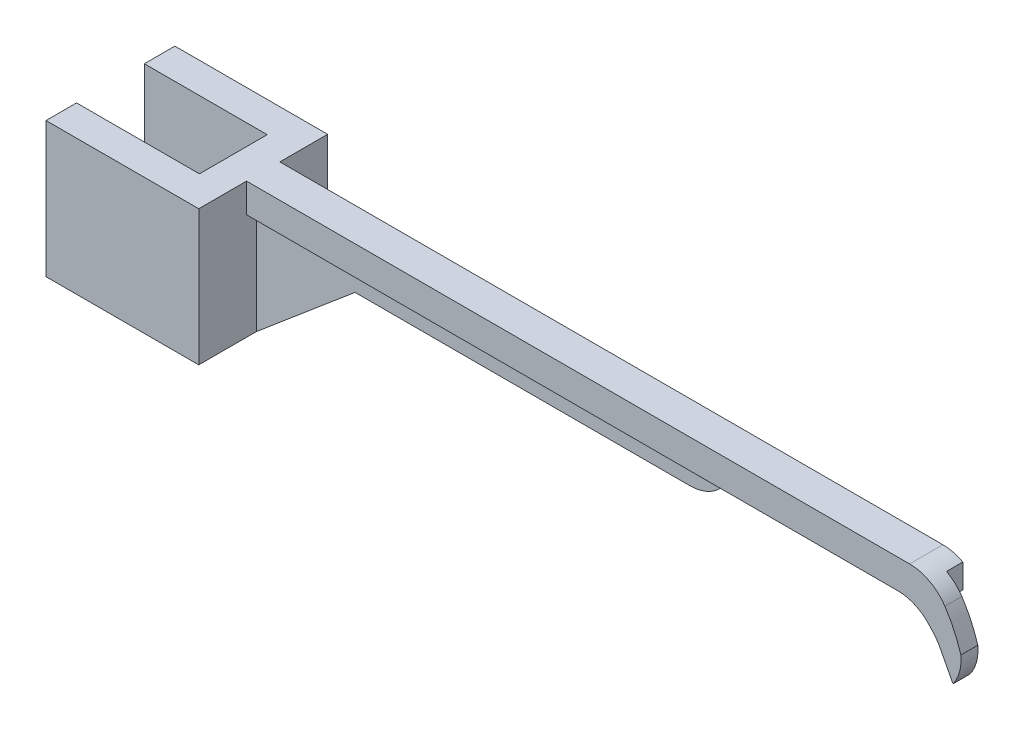
ISO-10303-21;
HEADER;
FILE_DESCRIPTION(('STEP AP214'),'2;1');
FILE_NAME('part.step','',(''),(''),'','','');
FILE_SCHEMA(('AUTOMOTIVE_DESIGN { 1 0 10303 214 1 1 1 1 }'));
ENDSEC;
DATA;
#1=APPLICATION_CONTEXT('core data for automotive mechanical design processes');
#2=APPLICATION_PROTOCOL_DEFINITION('international standard','automotive_design',2000,#1);
#3=PRODUCT_CONTEXT('',#1,'mechanical');
#4=PRODUCT('Part','Part','',(#3));
#5=PRODUCT_RELATED_PRODUCT_CATEGORY('part','',(#4));
#6=PRODUCT_DEFINITION_FORMATION('','',#4);
#7=PRODUCT_DEFINITION_CONTEXT('part definition',#1,'design');
#8=PRODUCT_DEFINITION('design','',#6,#7);
#9=PRODUCT_DEFINITION_SHAPE('','',#8);
#10=(LENGTH_UNIT() NAMED_UNIT(*) SI_UNIT(.MILLI.,.METRE.));
#11=(NAMED_UNIT(*) PLANE_ANGLE_UNIT() SI_UNIT($,.RADIAN.));
#12=(NAMED_UNIT(*) SI_UNIT($,.STERADIAN.) SOLID_ANGLE_UNIT());
#13=UNCERTAINTY_MEASURE_WITH_UNIT(LENGTH_MEASURE(1.E-05),#10,'distance_accuracy_value','');
#14=(GEOMETRIC_REPRESENTATION_CONTEXT(3) GLOBAL_UNCERTAINTY_ASSIGNED_CONTEXT((#13)) GLOBAL_UNIT_ASSIGNED_CONTEXT((#10,
#11,#12)) REPRESENTATION_CONTEXT('',''));
#15=CARTESIAN_POINT('',(0.,0.,0.));
#16=DIRECTION('',(0.,0.,1.));
#17=DIRECTION('',(1.,0.,0.));
#18=AXIS2_PLACEMENT_3D('',#15,#16,#17);
#19=CARTESIAN_POINT('',(2.38655555036114,14.2480483366258,0.));
#20=DIRECTION('',(0.,1.,0.));
#21=DIRECTION('',(0.,0.,1.));
#22=AXIS2_PLACEMENT_3D('',#19,#20,#21);
#23=PLANE('',#22);
#24=DIRECTION('',(0.,0.,1.));
#25=VECTOR('',#24,1.);
#26=CARTESIAN_POINT('',(-19.8893279320322,14.2480483366258,0.));
#27=LINE('',#26,#25);
#28=CARTESIAN_POINT('',(-19.8893279320322,14.2480483366258,-3.99999908856179));
#29=VERTEX_POINT('',#28);
#30=CARTESIAN_POINT('',(-19.8893279320322,14.2480483366258,4.000000606218));
#31=VERTEX_POINT('',#30);
#32=EDGE_CURVE('E321',#29,#31,#27,.T.);
#33=ORIENTED_EDGE('',*,*,#32,.T.);
#34=DIRECTION('',(-1.,0.,0.));
#35=VECTOR('',#34,1.);
#36=CARTESIAN_POINT('',(2.38655555036114,14.2480483366258,4.000000606218));
#37=LINE('',#36,#35);
#38=CARTESIAN_POINT('',(-34.385362257858,14.2480483366258,4.000000606218));
#39=VERTEX_POINT('',#38);
#40=EDGE_CURVE('E317',#31,#39,#37,.T.);
#41=ORIENTED_EDGE('',*,*,#40,.T.);
#42=DIRECTION('',(0.,0.,-1.));
#43=VECTOR('',#42,1.);
#44=CARTESIAN_POINT('',(-34.385362257858,14.2480483366258,-4.6027397260274));
#45=LINE('',#44,#43);
#46=CARTESIAN_POINT('',(-34.385362257858,14.2480483366258,7.6027397260274));
#47=VERTEX_POINT('',#46);
#48=EDGE_CURVE('E66',#47,#39,#45,.T.);
#49=ORIENTED_EDGE('',*,*,#48,.F.);
#50=DIRECTION('',(-1.,0.,0.));
#51=VECTOR('',#50,1.);
#52=CARTESIAN_POINT('',(-34.385362257858,14.2480483366258,7.6027397260274));
#53=LINE('',#52,#51);
#54=CARTESIAN_POINT('',(-16.3650904026096,14.2480483366258,7.6027397260274));
#55=VERTEX_POINT('',#54);
#56=EDGE_CURVE('E258',#55,#47,#53,.T.);
#57=ORIENTED_EDGE('',*,*,#56,.F.);
#58=DIRECTION('',(0.,0.,1.));
#59=VECTOR('',#58,1.);
#60=CARTESIAN_POINT('',(-16.3650904026096,14.2480483366258,0.));
#61=LINE('',#60,#59);
#62=CARTESIAN_POINT('',(-16.3650904026096,14.2480483366258,1.96383561643835));
#63=VERTEX_POINT('',#62);
#64=EDGE_CURVE('E368',#63,#55,#61,.T.);
#65=ORIENTED_EDGE('',*,*,#64,.F.);
#66=DIRECTION('',(-1.,0.,0.));
#67=VECTOR('',#66,1.);
#68=CARTESIAN_POINT('',(2.38655555036114,14.2480483366258,1.96383561643835));
#69=LINE('',#68,#67);
#70=CARTESIAN_POINT('',(61.853376654431,14.2480483366258,1.96383561643836));
#71=VERTEX_POINT('',#70);
#72=EDGE_CURVE('E370',#71,#63,#69,.T.);
#73=ORIENTED_EDGE('',*,*,#72,.F.);
#74=DIRECTION('',(0.,0.,-1.));
#75=VECTOR('',#74,1.);
#76=CARTESIAN_POINT('',(61.853376654431,14.2480483366258,0.));
#77=LINE('',#76,#75);
#78=CARTESIAN_POINT('',(61.853376654431,14.2480483366258,-1.96383561643835));
#79=VERTEX_POINT('',#78);
#80=EDGE_CURVE('E387',#71,#79,#77,.T.);
#81=ORIENTED_EDGE('',*,*,#80,.T.);
#82=DIRECTION('',(1.,0.,0.));
#83=VECTOR('',#82,1.);
#84=CARTESIAN_POINT('',(2.38655555036114,14.2480483366258,-1.96383561643836));
#85=LINE('',#84,#83);
#86=CARTESIAN_POINT('',(-16.3650904026096,14.2480483366258,-1.96383561643836));
#87=VERTEX_POINT('',#86);
#88=EDGE_CURVE('E361',#87,#79,#85,.T.);
#89=ORIENTED_EDGE('',*,*,#88,.F.);
#90=DIRECTION('',(0.,0.,1.));
#91=VECTOR('',#90,1.);
#92=CARTESIAN_POINT('',(-16.3650904026096,14.2480483366258,0.));
#93=LINE('',#92,#91);
#94=CARTESIAN_POINT('',(-16.3650904026096,14.2480483366258,-7.6027397260274));
#95=VERTEX_POINT('',#94);
#96=EDGE_CURVE('E366',#95,#87,#93,.T.);
#97=ORIENTED_EDGE('',*,*,#96,.F.);
#98=DIRECTION('',(1.,0.,0.));
#99=VECTOR('',#98,1.);
#100=CARTESIAN_POINT('',(-16.3650904026096,14.2480483366258,-7.6027397260274));
#101=LINE('',#100,#99);
#102=CARTESIAN_POINT('',(-34.385362257858,14.2480483366258,-7.6027397260274));
#103=VERTEX_POINT('',#102);
#104=EDGE_CURVE('E244',#103,#95,#101,.T.);
#105=ORIENTED_EDGE('',*,*,#104,.F.);
#106=CARTESIAN_POINT('',(-34.385362257858,14.2480483366258,-3.99999908856179));
#107=VERTEX_POINT('',#106);
#108=EDGE_CURVE('E279',#107,#103,#45,.T.);
#109=ORIENTED_EDGE('',*,*,#108,.F.);
#110=DIRECTION('',(1.,0.,0.));
#111=VECTOR('',#110,1.);
#112=CARTESIAN_POINT('',(2.38655555036114,14.2480483366258,-3.99999908856179));
#113=LINE('',#112,#111);
#114=EDGE_CURVE('E378',#107,#29,#113,.T.);
#115=ORIENTED_EDGE('',*,*,#114,.T.);
#116=EDGE_LOOP('',(#33,#41,#49,#57,#65,#73,#81,#89,#97,#105,#109,#115));
#117=FACE_BOUND('',#116,.T.);
#118=ADVANCED_FACE('F44',(#117),#23,.T.);
#119=CARTESIAN_POINT('',(-16.3650904026096,16.7028428571737,1.96383561643835));
#120=DIRECTION('',(-1.,0.,0.));
#121=DIRECTION('',(0.,0.,1.));
#122=AXIS2_PLACEMENT_3D('',#119,#120,#121);
#123=PLANE('',#122);
#124=DIRECTION('',(0.,-1.,0.));
#125=VECTOR('',#124,1.);
#126=CARTESIAN_POINT('',(-16.3650904026096,10.8113360078586,-0.797808219178089));
#127=LINE('',#126,#125);
#128=CARTESIAN_POINT('',(-16.3650904026096,10.8113360078586,-0.797808219178089));
#129=VERTEX_POINT('',#128);
#130=CARTESIAN_POINT('',(-16.3650904026096,-1.70811604693589,-0.797808219178082));
#131=VERTEX_POINT('',#130);
#132=EDGE_CURVE('E224',#129,#131,#127,.T.);
#133=ORIENTED_EDGE('',*,*,#132,.T.);
#134=DIRECTION('',(0.,0.,-1.));
#135=VECTOR('',#134,1.);
#136=CARTESIAN_POINT('',(-16.3650904026096,-1.70811604693589,1.96383561643835));
#137=LINE('',#136,#135);
#138=CARTESIAN_POINT('',(-16.3650904026096,-1.70811604693589,-7.6027397260274));
#139=VERTEX_POINT('',#138);
#140=EDGE_CURVE('E217',#131,#139,#137,.T.);
#141=ORIENTED_EDGE('',*,*,#140,.T.);
#142=DIRECTION('',(0.,-1.,0.));
#143=VECTOR('',#142,1.);
#144=CARTESIAN_POINT('',(-16.3650904026096,-1.70811604693589,-7.6027397260274));
#145=LINE('',#144,#143);
#146=EDGE_CURVE('E221',#95,#139,#145,.T.);
#147=ORIENTED_EDGE('',*,*,#146,.F.);
#148=ORIENTED_EDGE('',*,*,#96,.T.);
#149=DIRECTION('',(0.,-1.,0.));
#150=VECTOR('',#149,1.);
#151=CARTESIAN_POINT('',(-16.3650904026096,16.7028428571737,-1.96383561643836));
#152=LINE('',#151,#150);
#153=CARTESIAN_POINT('',(-16.3650904026096,10.8113360078586,-1.96383561643836));
#154=VERTEX_POINT('',#153);
#155=EDGE_CURVE('E229',#87,#154,#152,.T.);
#156=ORIENTED_EDGE('',*,*,#155,.T.);
#157=DIRECTION('',(0.,0.,-1.));
#158=VECTOR('',#157,1.);
#159=CARTESIAN_POINT('',(-16.3650904026096,10.8113360078586,-0.797808219178089));
#160=LINE('',#159,#158);
#161=EDGE_CURVE('E353',#129,#154,#160,.T.);
#162=ORIENTED_EDGE('',*,*,#161,.F.);
#163=EDGE_LOOP('',(#133,#141,#147,#148,#156,#162));
#164=FACE_BOUND('',#163,.T.);
#165=ADVANCED_FACE('F219',(#164),#123,.F.);
#166=CARTESIAN_POINT('',(39.2084733585803,16.7028428571737,-1.96383561643836));
#167=DIRECTION('',(0.,0.,1.));
#168=DIRECTION('',(1.,0.,0.));
#169=AXIS2_PLACEMENT_3D('',#166,#167,#168);
#170=PLANE('',#169);
#171=ORIENTED_EDGE('',*,*,#88,.T.);
#172=CARTESIAN_POINT('',(61.853376654431,9.24804833662575,-1.96383561643835));
#173=DIRECTION('',(0.,0.,1.));
#174=DIRECTION('',(1.,0.,0.));
#175=AXIS2_PLACEMENT_3D('',#172,#173,#174);
#176=CIRCLE('',#175,5.);
#177=CARTESIAN_POINT('',(64.2084733585803,13.6586627512062,-1.96383561643836));
#178=VERTEX_POINT('',#177);
#179=EDGE_CURVE('E390',#79,#178,#176,.F.);
#180=ORIENTED_EDGE('',*,*,#179,.T.);
#181=DIRECTION('',(0.,1.,0.));
#182=VECTOR('',#181,1.);
#183=CARTESIAN_POINT('',(64.2084733585803,14.2480483366258,-1.96383561643836));
#184=LINE('',#183,#182);
#185=CARTESIAN_POINT('',(64.2084733585803,10.8113360078586,-1.96383561643836));
#186=VERTEX_POINT('',#185);
#187=EDGE_CURVE('E310',#186,#178,#184,.T.);
#188=ORIENTED_EDGE('',*,*,#187,.F.);
#189=DIRECTION('',(1.,0.,0.));
#190=VECTOR('',#189,1.);
#191=CARTESIAN_POINT('',(-16.3650904026096,10.8113360078586,-1.96383561643836));
#192=LINE('',#191,#190);
#193=EDGE_CURVE('E348',#154,#186,#192,.T.);
#194=ORIENTED_EDGE('',*,*,#193,.F.);
#195=ORIENTED_EDGE('',*,*,#155,.F.);
#196=EDGE_LOOP('',(#171,#180,#188,#194,#195));
#197=FACE_BOUND('',#196,.T.);
#198=ADVANCED_FACE('F468',(#197),#170,.F.);
#199=CARTESIAN_POINT('',(39.2084733585803,16.7028428571737,1.96383561643836));
#200=DIRECTION('',(0.,0.,-1.));
#201=DIRECTION('',(-1.,0.,0.));
#202=AXIS2_PLACEMENT_3D('',#199,#200,#201);
#203=PLANE('',#202);
#204=DIRECTION('',(0.46167936838305,-0.887046876331475,0.));
#205=VECTOR('',#204,1.);
#206=CARTESIAN_POINT('',(65.1374582224198,8.07903322997877,1.96383561643835));
#207=LINE('',#206,#205);
#208=CARTESIAN_POINT('',(65.4301700461861,7.51663186071994,1.96383561643835));
#209=VERTEX_POINT('',#208);
#210=CARTESIAN_POINT('',(66.9741281549923,4.55015055054178,1.96383561643835));
#211=VERTEX_POINT('',#210);
#212=EDGE_CURVE('E286',#209,#211,#207,.T.);
#213=ORIENTED_EDGE('',*,*,#212,.T.);
#214=CARTESIAN_POINT('',(62.9264032674871,7.48543984379218,1.96383561643836));
#215=DIRECTION('',(0.,0.,-1.));
#216=DIRECTION('',(-1.,0.,0.));
#217=AXIS2_PLACEMENT_3D('',#214,#215,#216);
#218=CIRCLE('',#217,5.);
#219=CARTESIAN_POINT('',(67.9035731617334,7.96270271036375,1.96383561643835));
#220=VERTEX_POINT('',#219);
#221=EDGE_CURVE('E419',#211,#220,#218,.F.);
#222=ORIENTED_EDGE('',*,*,#221,.T.);
#223=DIRECTION('',(-0.0954525733143143,0.995433978849263,0.));
#224=VECTOR('',#223,1.);
#225=CARTESIAN_POINT('',(67.9031644469349,7.96696502183314,1.96383561643835));
#226=LINE('',#225,#224);
#227=CARTESIAN_POINT('',(67.9031644469349,7.96696502183314,1.96383561643835));
#228=VERTEX_POINT('',#227);
#229=EDGE_CURVE('E299',#220,#228,#226,.T.);
#230=ORIENTED_EDGE('',*,*,#229,.T.);
#231=CARTESIAN_POINT('',(53.5142809294304,3.72903733017923,1.96383561643836));
#232=DIRECTION('',(0.,0.,-1.));
#233=DIRECTION('',(-1.,0.,0.));
#234=AXIS2_PLACEMENT_3D('',#231,#232,#233);
#235=CIRCLE('',#234,15.);
#236=CARTESIAN_POINT('',(66.0229245169312,12.007553839849,1.96383561643836));
#237=VERTEX_POINT('',#236);
#238=EDGE_CURVE('E316',#228,#237,#235,.F.);
#239=ORIENTED_EDGE('',*,*,#238,.T.);
#240=CARTESIAN_POINT('',(61.853376654431,9.24804833662575,1.96383561643836));
#241=DIRECTION('',(0.,0.,-1.));
#242=DIRECTION('',(-1.,0.,0.));
#243=AXIS2_PLACEMENT_3D('',#240,#241,#242);
#244=CIRCLE('',#243,5.);
#245=EDGE_CURVE('E398',#237,#71,#244,.F.);
#246=ORIENTED_EDGE('',*,*,#245,.T.);
#247=ORIENTED_EDGE('',*,*,#72,.T.);
#248=DIRECTION('',(0.,-1.,0.));
#249=VECTOR('',#248,1.);
#250=CARTESIAN_POINT('',(-16.3650904026096,16.7028428571737,1.96383561643835));
#251=LINE('',#250,#249);
#252=CARTESIAN_POINT('',(-16.3650904026096,10.8113360078586,1.96383561643835));
#253=VERTEX_POINT('',#252);
#254=EDGE_CURVE('E358',#63,#253,#251,.T.);
#255=ORIENTED_EDGE('',*,*,#254,.T.);
#256=DIRECTION('',(-1.,0.,0.));
#257=VECTOR('',#256,1.);
#258=CARTESIAN_POINT('',(-16.3650904026096,10.8113360078586,1.96383561643835));
#259=LINE('',#258,#257);
#260=CARTESIAN_POINT('',(60.4528732588578,10.8113360078586,1.96383561643836));
#261=VERTEX_POINT('',#260);
#262=EDGE_CURVE('E335',#261,#253,#259,.T.);
#263=ORIENTED_EDGE('',*,*,#262,.F.);
#264=CARTESIAN_POINT('',(60.4528732588578,5.81133600785863,1.96383561643836));
#265=DIRECTION('',(0.,0.,-1.));
#266=DIRECTION('',(-1.,0.,0.));
#267=AXIS2_PLACEMENT_3D('',#264,#265,#266);
#268=CIRCLE('',#267,5.);
#269=CARTESIAN_POINT('',(64.171576660401,9.15367725485167,1.96383561643835));
#270=VERTEX_POINT('',#269);
#271=EDGE_CURVE('E405',#261,#270,#268,.T.);
#272=ORIENTED_EDGE('',*,*,#271,.T.);
#273=DIRECTION('',(0.668468249398608,-0.743740680308641,0.));
#274=VECTOR('',#273,1.);
#275=CARTESIAN_POINT('',(62.6816860653847,10.8113360078586,1.96383561643835));
#276=LINE('',#275,#274);
#277=CARTESIAN_POINT('',(64.713639066072,8.55057626579773,1.96383561643835));
#278=VERTEX_POINT('',#277);
#279=EDGE_CURVE('E282',#270,#278,#276,.T.);
#280=ORIENTED_EDGE('',*,*,#279,.T.);
#281=CARTESIAN_POINT('',(60.9949356645288,5.20823501880469,1.96383561643836));
#282=DIRECTION('',(0.,0.,-1.));
#283=DIRECTION('',(-1.,0.,0.));
#284=AXIS2_PLACEMENT_3D('',#281,#282,#283);
#285=CIRCLE('',#284,5.);
#286=EDGE_CURVE('E415',#278,#209,#285,.T.);
#287=ORIENTED_EDGE('',*,*,#286,.T.);
#288=EDGE_LOOP('',(#213,#222,#230,#239,#246,#247,#255,#263,#272,#280,#287));
#289=FACE_BOUND('',#288,.T.);
#290=ADVANCED_FACE('F454',(#289),#203,.F.);
#291=CARTESIAN_POINT('',(2.38655555036114,-1.70811604693589,0.));
#292=DIRECTION('',(0.,1.,0.));
#293=DIRECTION('',(0.,0.,1.));
#294=AXIS2_PLACEMENT_3D('',#291,#292,#293);
#295=PLANE('',#294);
#296=CARTESIAN_POINT('',(-30.3849512989539,-1.70811604693589,0.));
#297=DIRECTION('',(0.,1.,0.));
#298=DIRECTION('',(0.,0.,1.));
#299=AXIS2_PLACEMENT_3D('',#296,#297,#298);
#300=CIRCLE('',#299,1.22739726027397);
#301=CARTESIAN_POINT('',(-30.3849512989539,-1.70811604693589,1.22739726027398));
#302=VERTEX_POINT('',#301);
#303=EDGE_CURVE('E375',#302,#302,#300,.T.);
#304=ORIENTED_EDGE('',*,*,#303,.T.);
#305=EDGE_LOOP('',(#304));
#306=FACE_BOUND('',#305,.T.);
#307=CARTESIAN_POINT('',(-23.3887869153923,-1.70811604693589,0.));
#308=DIRECTION('',(0.,1.,0.));
#309=DIRECTION('',(0.,0.,1.));
#310=AXIS2_PLACEMENT_3D('',#307,#308,#309);
#311=CIRCLE('',#310,1.22739726027397);
#312=CARTESIAN_POINT('',(-23.3887869153923,-1.70811604693589,1.22739726027398));
#313=VERTEX_POINT('',#312);
#314=EDGE_CURVE('E372',#313,#313,#311,.T.);
#315=ORIENTED_EDGE('',*,*,#314,.T.);
#316=EDGE_LOOP('',(#315));
#317=FACE_BOUND('',#316,.T.);
#318=CARTESIAN_POINT('',(-16.3650904026096,-1.70811604693589,7.6027397260274));
#319=VERTEX_POINT('',#318);
#320=CARTESIAN_POINT('',(-16.3650904026096,-1.70811604693589,0.797808219178083));
#321=VERTEX_POINT('',#320);
#322=EDGE_CURVE('E228',#319,#321,#137,.T.);
#323=ORIENTED_EDGE('',*,*,#322,.F.);
#324=DIRECTION('',(1.,0.,0.));
#325=VECTOR('',#324,1.);
#326=CARTESIAN_POINT('',(-16.3650904026096,-1.70811604693589,7.6027397260274));
#327=LINE('',#326,#325);
#328=CARTESIAN_POINT('',(-34.385362257858,-1.70811604693589,7.6027397260274));
#329=VERTEX_POINT('',#328);
#330=EDGE_CURVE('E252',#329,#319,#327,.T.);
#331=ORIENTED_EDGE('',*,*,#330,.F.);
#332=DIRECTION('',(0.,0.,1.));
#333=VECTOR('',#332,1.);
#334=CARTESIAN_POINT('',(-34.385362257858,-1.70811604693589,4.6027397260274));
#335=LINE('',#334,#333);
#336=CARTESIAN_POINT('',(-34.385362257858,-1.70811604693589,-7.6027397260274));
#337=VERTEX_POINT('',#336);
#338=EDGE_CURVE('E235',#337,#329,#335,.T.);
#339=ORIENTED_EDGE('',*,*,#338,.F.);
#340=DIRECTION('',(-1.,0.,0.));
#341=VECTOR('',#340,1.);
#342=CARTESIAN_POINT('',(-34.385362257858,-1.70811604693589,-7.6027397260274));
#343=LINE('',#342,#341);
#344=EDGE_CURVE('E232',#139,#337,#343,.T.);
#345=ORIENTED_EDGE('',*,*,#344,.F.);
#346=ORIENTED_EDGE('',*,*,#140,.F.);
#347=DIRECTION('',(0.,0.,-1.));
#348=VECTOR('',#347,1.);
#349=CARTESIAN_POINT('',(-16.3650904026096,-1.70811604693589,1.96383561643835));
#350=LINE('',#349,#348);
#351=EDGE_CURVE('E332',#131,#321,#350,.F.);
#352=ORIENTED_EDGE('',*,*,#351,.T.);
#353=EDGE_LOOP('',(#323,#331,#339,#345,#346,#352));
#354=FACE_BOUND('',#353,.T.);
#355=ADVANCED_FACE('F233',(#306,#317,#354),#295,.F.);
#356=CARTESIAN_POINT('',(-23.3887869153923,-10.9135954989907,0.));
#357=DIRECTION('',(0.,1.,0.));
#358=DIRECTION('',(0.,0.,1.));
#359=AXIS2_PLACEMENT_3D('',#356,#357,#358);
#360=CYLINDRICAL_SURFACE('',#359,1.22739726027397);
#361=CARTESIAN_POINT('',(-23.3887869153923,2.08804833662575,0.));
#362=DIRECTION('',(0.,-1.,0.));
#363=DIRECTION('',(0.,0.,-1.));
#364=AXIS2_PLACEMENT_3D('',#361,#362,#363);
#365=CIRCLE('',#364,1.22739726027397);
#366=CARTESIAN_POINT('',(-23.3887869153923,2.08804833662575,-1.22739726027397));
#367=VERTEX_POINT('',#366);
#368=EDGE_CURVE('E275',#367,#367,#365,.F.);
#369=ORIENTED_EDGE('',*,*,#368,.T.);
#370=EDGE_LOOP('',(#369));
#371=FACE_BOUND('',#370,.T.);
#372=ORIENTED_EDGE('',*,*,#314,.F.);
#373=EDGE_LOOP('',(#372));
#374=FACE_BOUND('',#373,.T.);
#375=ADVANCED_FACE('F499',(#371,#374),#360,.F.);
#376=CARTESIAN_POINT('',(-30.3849512989539,-10.9135954989907,0.));
#377=DIRECTION('',(0.,1.,0.));
#378=DIRECTION('',(0.,0.,1.));
#379=AXIS2_PLACEMENT_3D('',#376,#377,#378);
#380=CYLINDRICAL_SURFACE('',#379,1.22739726027397);
#381=CARTESIAN_POINT('',(-30.3849512989539,2.08804833662575,0.));
#382=DIRECTION('',(0.,-1.,0.));
#383=DIRECTION('',(0.,0.,-1.));
#384=AXIS2_PLACEMENT_3D('',#381,#382,#383);
#385=CIRCLE('',#384,1.22739726027397);
#386=CARTESIAN_POINT('',(-30.3849512989539,2.08804833662575,-1.22739726027397));
#387=VERTEX_POINT('',#386);
#388=EDGE_CURVE('E272',#387,#387,#385,.F.);
#389=ORIENTED_EDGE('',*,*,#388,.T.);
#390=EDGE_LOOP('',(#389));
#391=FACE_BOUND('',#390,.T.);
#392=ORIENTED_EDGE('',*,*,#303,.F.);
#393=EDGE_LOOP('',(#392));
#394=FACE_BOUND('',#393,.T.);
#395=ADVANCED_FACE('F502',(#391,#394),#380,.F.);
#396=ORIENTED_EDGE('',*,*,#322,.T.);
#397=DIRECTION('',(0.,-1.,0.));
#398=VECTOR('',#397,1.);
#399=CARTESIAN_POINT('',(-16.3650904026096,10.8113360078586,0.797808219178076));
#400=LINE('',#399,#398);
#401=CARTESIAN_POINT('',(-16.3650904026096,10.8113360078586,0.797808219178076));
#402=VERTEX_POINT('',#401);
#403=EDGE_CURVE('E344',#402,#321,#400,.T.);
#404=ORIENTED_EDGE('',*,*,#403,.F.);
#405=DIRECTION('',(0.,0.,-1.));
#406=VECTOR('',#405,1.);
#407=CARTESIAN_POINT('',(-16.3650904026096,10.8113360078586,0.797808219178076));
#408=LINE('',#407,#406);
#409=EDGE_CURVE('E337',#253,#402,#408,.T.);
#410=ORIENTED_EDGE('',*,*,#409,.F.);
#411=ORIENTED_EDGE('',*,*,#254,.F.);
#412=ORIENTED_EDGE('',*,*,#64,.T.);
#413=DIRECTION('',(0.,1.,0.));
#414=VECTOR('',#413,1.);
#415=CARTESIAN_POINT('',(-16.3650904026096,14.2480483366258,7.6027397260274));
#416=LINE('',#415,#414);
#417=EDGE_CURVE('E255',#319,#55,#416,.T.);
#418=ORIENTED_EDGE('',*,*,#417,.F.);
#419=EDGE_LOOP('',(#396,#404,#410,#411,#412,#418));
#420=FACE_BOUND('',#419,.T.);
#421=ADVANCED_FACE('F451',(#420),#123,.F.);
#422=CARTESIAN_POINT('',(2.38655555036114,8.11106203525589,0.));
#423=DIRECTION('',(0.,-1.,0.));
#424=DIRECTION('',(0.,0.,-1.));
#425=AXIS2_PLACEMENT_3D('',#422,#423,#424);
#426=PLANE('',#425);
#427=DIRECTION('',(-1.,0.,0.));
#428=VECTOR('',#427,1.);
#429=CARTESIAN_POINT('',(39.2084733585803,8.11106203525589,-0.797808219178082));
#430=LINE('',#429,#428);
#431=CARTESIAN_POINT('',(34.7687368575128,8.11106203525589,-0.797808219178082));
#432=VERTEX_POINT('',#431);
#433=CARTESIAN_POINT('',(-4.73507218384127,8.11106203525589,-0.797808219178082));
#434=VERTEX_POINT('',#433);
#435=EDGE_CURVE('E334',#432,#434,#430,.T.);
#436=ORIENTED_EDGE('',*,*,#435,.F.);
#437=DIRECTION('',(0.,0.,1.));
#438=VECTOR('',#437,1.);
#439=CARTESIAN_POINT('',(34.7687368575128,8.11106203525589,0.797808219178083));
#440=LINE('',#439,#438);
#441=CARTESIAN_POINT('',(34.7687368575128,8.11106203525589,0.797808219178082));
#442=VERTEX_POINT('',#441);
#443=EDGE_CURVE('E425',#432,#442,#440,.T.);
#444=ORIENTED_EDGE('',*,*,#443,.T.);
#445=DIRECTION('',(1.,0.,0.));
#446=VECTOR('',#445,1.);
#447=CARTESIAN_POINT('',(39.2084733585803,8.11106203525589,0.797808219178083));
#448=LINE('',#447,#446);
#449=CARTESIAN_POINT('',(-4.73507218384128,8.11106203525589,0.79780821917808));
#450=VERTEX_POINT('',#449);
#451=EDGE_CURVE('E338',#450,#442,#448,.T.);
#452=ORIENTED_EDGE('',*,*,#451,.F.);
#453=DIRECTION('',(0.,0.,-1.));
#454=VECTOR('',#453,1.);
#455=CARTESIAN_POINT('',(-4.73507218384126,8.11106203525589,0.));
#456=LINE('',#455,#454);
#457=EDGE_CURVE('E327',#434,#450,#456,.F.);
#458=ORIENTED_EDGE('',*,*,#457,.F.);
#459=EDGE_LOOP('',(#436,#444,#452,#458));
#460=FACE_BOUND('',#459,.T.);
#461=ADVANCED_FACE('F440',(#460),#426,.T.);
#462=CARTESIAN_POINT('',(39.2084733585803,10.8113360078586,-0.797808219178082));
#463=DIRECTION('',(0.,0.,1.));
#464=DIRECTION('',(1.,0.,0.));
#465=AXIS2_PLACEMENT_3D('',#462,#463,#464);
#466=PLANE('',#465);
#467=DIRECTION('',(-1.,0.,0.));
#468=VECTOR('',#467,1.);
#469=CARTESIAN_POINT('',(39.2084733585803,10.8113360078586,-0.797808219178082));
#470=LINE('',#469,#468);
#471=CARTESIAN_POINT('',(39.2084733585803,10.8113360078586,-0.797808219178082));
#472=VERTEX_POINT('',#471);
#473=EDGE_CURVE('E351',#472,#129,#470,.T.);
#474=ORIENTED_EDGE('',*,*,#473,.F.);
#475=CARTESIAN_POINT('',(34.7687368575128,13.1110620352559,-0.797808219178082));
#476=DIRECTION('',(0.,0.,1.));
#477=DIRECTION('',(1.,0.,0.));
#478=AXIS2_PLACEMENT_3D('',#475,#476,#477);
#479=CIRCLE('',#478,5.);
#480=EDGE_CURVE('E52',#472,#432,#479,.F.);
#481=ORIENTED_EDGE('',*,*,#480,.T.);
#482=ORIENTED_EDGE('',*,*,#435,.T.);
#483=DIRECTION('',(-0.764085816930842,-0.645114613355741,0.));
#484=VECTOR('',#483,1.);
#485=CARTESIAN_POINT('',(-4.73507218384126,8.11106203525589,-0.797808219178082));
#486=LINE('',#485,#484);
#487=EDGE_CURVE('E323',#434,#131,#486,.T.);
#488=ORIENTED_EDGE('',*,*,#487,.T.);
#489=ORIENTED_EDGE('',*,*,#132,.F.);
#490=EDGE_LOOP('',(#474,#481,#482,#488,#489));
#491=FACE_BOUND('',#490,.T.);
#492=ADVANCED_FACE('F433',(#491),#466,.F.);
#493=CARTESIAN_POINT('',(39.2084733585803,10.8113360078586,0.797808219178083));
#494=DIRECTION('',(0.,0.,-1.));
#495=DIRECTION('',(-1.,0.,0.));
#496=AXIS2_PLACEMENT_3D('',#493,#494,#495);
#497=PLANE('',#496);
#498=ORIENTED_EDGE('',*,*,#451,.T.);
#499=CARTESIAN_POINT('',(34.7687368575128,13.1110620352559,0.797808219178082));
#500=DIRECTION('',(0.,0.,-1.));
#501=DIRECTION('',(-1.,0.,0.));
#502=AXIS2_PLACEMENT_3D('',#499,#500,#501);
#503=CIRCLE('',#502,5.);
#504=CARTESIAN_POINT('',(39.2084733585803,10.8113360078586,0.797808219178083));
#505=VERTEX_POINT('',#504);
#506=EDGE_CURVE('E428',#442,#505,#503,.F.);
#507=ORIENTED_EDGE('',*,*,#506,.T.);
#508=DIRECTION('',(1.,0.,0.));
#509=VECTOR('',#508,1.);
#510=CARTESIAN_POINT('',(39.2084733585803,10.8113360078586,0.797808219178083));
#511=LINE('',#510,#509);
#512=EDGE_CURVE('E341',#402,#505,#511,.T.);
#513=ORIENTED_EDGE('',*,*,#512,.F.);
#514=ORIENTED_EDGE('',*,*,#403,.T.);
#515=DIRECTION('',(-0.764085816930842,-0.645114613355741,0.));
#516=VECTOR('',#515,1.);
#517=CARTESIAN_POINT('',(-4.73507218384126,8.11106203525589,0.797808219178083));
#518=LINE('',#517,#516);
#519=EDGE_CURVE('E324',#450,#321,#518,.T.);
#520=ORIENTED_EDGE('',*,*,#519,.F.);
#521=EDGE_LOOP('',(#498,#507,#513,#514,#520));
#522=FACE_BOUND('',#521,.T.);
#523=ADVANCED_FACE('F444',(#522),#497,.F.);
#524=CARTESIAN_POINT('',(2.38655555036114,10.8113360078586,0.));
#525=DIRECTION('',(0.,1.,0.));
#526=DIRECTION('',(0.,0.,1.));
#527=AXIS2_PLACEMENT_3D('',#524,#525,#526);
#528=PLANE('',#527);
#529=DIRECTION('',(-1.,0.,0.));
#530=VECTOR('',#529,1.);
#531=CARTESIAN_POINT('',(64.2084733585803,10.8113360078586,-0.0361643835616481));
#532=LINE('',#531,#530);
#533=CARTESIAN_POINT('',(64.2084733585803,10.8113360078586,-0.0361643835616481));
#534=VERTEX_POINT('',#533);
#535=CARTESIAN_POINT('',(60.4528732588578,10.8113360078586,-0.0361643835616481));
#536=VERTEX_POINT('',#535);
#537=EDGE_CURVE('E283',#534,#536,#532,.T.);
#538=ORIENTED_EDGE('',*,*,#537,.T.);
#539=DIRECTION('',(0.,0.,1.));
#540=VECTOR('',#539,1.);
#541=CARTESIAN_POINT('',(60.4528732588578,10.8113360078586,0.));
#542=LINE('',#541,#540);
#543=EDGE_CURVE('E400',#536,#261,#542,.T.);
#544=ORIENTED_EDGE('',*,*,#543,.T.);
#545=ORIENTED_EDGE('',*,*,#262,.T.);
#546=ORIENTED_EDGE('',*,*,#409,.T.);
#547=ORIENTED_EDGE('',*,*,#512,.T.);
#548=DIRECTION('',(0.,0.,-1.));
#549=VECTOR('',#548,1.);
#550=CARTESIAN_POINT('',(39.2084733585803,10.8113360078586,-1.96383561643836));
#551=LINE('',#550,#549);
#552=EDGE_CURVE('E314',#505,#472,#551,.T.);
#553=ORIENTED_EDGE('',*,*,#552,.T.);
#554=ORIENTED_EDGE('',*,*,#473,.T.);
#555=ORIENTED_EDGE('',*,*,#161,.T.);
#556=ORIENTED_EDGE('',*,*,#193,.T.);
#557=DIRECTION('',(0.,0.,-1.));
#558=VECTOR('',#557,1.);
#559=CARTESIAN_POINT('',(64.2084733585803,10.8113360078586,-1.96383561643836));
#560=LINE('',#559,#558);
#561=EDGE_CURVE('E308',#534,#186,#560,.T.);
#562=ORIENTED_EDGE('',*,*,#561,.F.);
#563=EDGE_LOOP('',(#538,#544,#545,#546,#547,#553,#554,#555,#556,#562));
#564=FACE_BOUND('',#563,.T.);
#565=ADVANCED_FACE('F446',(#564),#528,.F.);
#566=CARTESIAN_POINT('',(-4.73507218384126,8.11106203525589,0.));
#567=DIRECTION('',(-0.645114613355741,0.764085816930842,0.));
#568=DIRECTION('',(-0.764085816930842,-0.645114613355741,0.));
#569=AXIS2_PLACEMENT_3D('',#566,#567,#568);
#570=PLANE('',#569);
#571=ORIENTED_EDGE('',*,*,#351,.F.);
#572=ORIENTED_EDGE('',*,*,#487,.F.);
#573=ORIENTED_EDGE('',*,*,#457,.T.);
#574=ORIENTED_EDGE('',*,*,#519,.T.);
#575=EDGE_LOOP('',(#571,#572,#573,#574));
#576=FACE_BOUND('',#575,.T.);
#577=ADVANCED_FACE('F535',(#576),#570,.F.);
#578=CARTESIAN_POINT('',(-19.8893279320322,17.6491442270367,-3.99999908856179));
#579=DIRECTION('',(0.,0.,1.));
#580=DIRECTION('',(1.,0.,0.));
#581=AXIS2_PLACEMENT_3D('',#578,#579,#580);
#582=PLANE('',#581);
#583=DIRECTION('',(0.,1.,0.));
#584=VECTOR('',#583,1.);
#585=CARTESIAN_POINT('',(-34.385362257858,17.6491442270367,-3.99999908856179));
#586=LINE('',#585,#584);
#587=CARTESIAN_POINT('',(-34.385362257858,2.08804833662575,-3.99999908856179));
#588=VERTEX_POINT('',#587);
#589=EDGE_CURVE('E59',#588,#107,#586,.T.);
#590=ORIENTED_EDGE('',*,*,#589,.F.);
#591=DIRECTION('',(-1.,0.,0.));
#592=VECTOR('',#591,1.);
#593=CARTESIAN_POINT('',(-34.385362257858,2.08804833662575,-3.99999908856179));
#594=LINE('',#593,#592);
#595=CARTESIAN_POINT('',(-19.8893279320322,2.08804833662575,-3.99999908856179));
#596=VERTEX_POINT('',#595);
#597=EDGE_CURVE('E270',#596,#588,#594,.T.);
#598=ORIENTED_EDGE('',*,*,#597,.F.);
#599=DIRECTION('',(0.,-1.,0.));
#600=VECTOR('',#599,1.);
#601=CARTESIAN_POINT('',(-19.8893279320322,17.6491442270367,-3.99999908856179));
#602=LINE('',#601,#600);
#603=EDGE_CURVE('E313',#29,#596,#602,.T.);
#604=ORIENTED_EDGE('',*,*,#603,.F.);
#605=ORIENTED_EDGE('',*,*,#114,.F.);
#606=EDGE_LOOP('',(#590,#598,#604,#605));
#607=FACE_BOUND('',#606,.T.);
#608=ADVANCED_FACE('F478',(#607),#582,.T.);
#609=CARTESIAN_POINT('',(-19.8893279320322,17.6491442270367,4.000000606218));
#610=DIRECTION('',(-1.,0.,0.));
#611=DIRECTION('',(0.,0.,1.));
#612=AXIS2_PLACEMENT_3D('',#609,#610,#611);
#613=PLANE('',#612);
#614=DIRECTION('',(0.,-1.,0.));
#615=VECTOR('',#614,1.);
#616=CARTESIAN_POINT('',(-19.8893279320322,17.6491442270367,4.000000606218));
#617=LINE('',#616,#615);
#618=CARTESIAN_POINT('',(-19.8893279320322,2.08804833662575,4.000000606218));
#619=VERTEX_POINT('',#618);
#620=EDGE_CURVE('E319',#31,#619,#617,.T.);
#621=ORIENTED_EDGE('',*,*,#620,.F.);
#622=ORIENTED_EDGE('',*,*,#32,.F.);
#623=ORIENTED_EDGE('',*,*,#603,.T.);
#624=DIRECTION('',(0.,0.,-1.));
#625=VECTOR('',#624,1.);
#626=CARTESIAN_POINT('',(-19.8893279320322,2.08804833662575,-3.99999908856179));
#627=LINE('',#626,#625);
#628=EDGE_CURVE('E267',#619,#596,#627,.T.);
#629=ORIENTED_EDGE('',*,*,#628,.F.);
#630=EDGE_LOOP('',(#621,#622,#623,#629));
#631=FACE_BOUND('',#630,.T.);
#632=ADVANCED_FACE('F483',(#631),#613,.T.);
#633=CARTESIAN_POINT('',(-19.8893279320322,17.6491442270367,4.000000606218));
#634=DIRECTION('',(0.,0.,-1.));
#635=DIRECTION('',(-1.,0.,0.));
#636=AXIS2_PLACEMENT_3D('',#633,#634,#635);
#637=PLANE('',#636);
#638=DIRECTION('',(0.,-1.,0.));
#639=VECTOR('',#638,1.);
#640=CARTESIAN_POINT('',(-34.385362257858,17.6491442270367,4.000000606218));
#641=LINE('',#640,#639);
#642=CARTESIAN_POINT('',(-34.385362257858,2.08804833662575,4.000000606218));
#643=VERTEX_POINT('',#642);
#644=EDGE_CURVE('E12',#39,#643,#641,.T.);
#645=ORIENTED_EDGE('',*,*,#644,.F.);
#646=ORIENTED_EDGE('',*,*,#40,.F.);
#647=ORIENTED_EDGE('',*,*,#620,.T.);
#648=DIRECTION('',(1.,0.,0.));
#649=VECTOR('',#648,1.);
#650=CARTESIAN_POINT('',(-19.8893279320322,2.08804833662575,4.000000606218));
#651=LINE('',#650,#649);
#652=EDGE_CURVE('E264',#643,#619,#651,.T.);
#653=ORIENTED_EDGE('',*,*,#652,.F.);
#654=EDGE_LOOP('',(#645,#646,#647,#653));
#655=FACE_BOUND('',#654,.T.);
#656=ADVANCED_FACE('F486',(#655),#637,.T.);
#657=CARTESIAN_POINT('',(64.2084733585803,0.,0.));
#658=DIRECTION('',(-1.,0.,0.));
#659=DIRECTION('',(0.,0.,1.));
#660=AXIS2_PLACEMENT_3D('',#657,#658,#659);
#661=PLANE('',#660);
#662=ORIENTED_EDGE('',*,*,#187,.T.);
#663=DIRECTION('',(0.,0.,-1.));
#664=VECTOR('',#663,1.);
#665=CARTESIAN_POINT('',(64.2084733585803,13.6586627512062,-1.96383561643836));
#666=LINE('',#665,#664);
#667=CARTESIAN_POINT('',(64.2084733585803,13.6586627512062,-0.0361643835616481));
#668=VERTEX_POINT('',#667);
#669=EDGE_CURVE('E392',#178,#668,#666,.F.);
#670=ORIENTED_EDGE('',*,*,#669,.T.);
#671=DIRECTION('',(0.,-1.,0.));
#672=VECTOR('',#671,1.);
#673=CARTESIAN_POINT('',(64.2084733585803,10.8113360078586,-0.0361643835616481));
#674=LINE('',#673,#672);
#675=EDGE_CURVE('E300',#668,#534,#674,.T.);
#676=ORIENTED_EDGE('',*,*,#675,.T.);
#677=ORIENTED_EDGE('',*,*,#561,.T.);
#678=EDGE_LOOP('',(#662,#670,#676,#677));
#679=FACE_BOUND('',#678,.T.);
#680=ADVANCED_FACE('F472',(#679),#661,.F.);
#681=CARTESIAN_POINT('',(67.9031644469349,7.96696502183314,-0.0361643835616481));
#682=DIRECTION('',(0.995433978849263,0.0954525733143143,0.));
#683=DIRECTION('',(-0.0954525733143143,0.995433978849263,0.));
#684=AXIS2_PLACEMENT_3D('',#681,#682,#683);
#685=PLANE('',#684);
#686=ORIENTED_EDGE('',*,*,#229,.F.);
#687=DIRECTION('',(0.,0.,1.));
#688=VECTOR('',#687,1.);
#689=CARTESIAN_POINT('',(67.9035731617334,7.96270271036375,-0.0361643835616481));
#690=LINE('',#689,#688);
#691=CARTESIAN_POINT('',(67.9035731617334,7.96270271036375,-0.0361643835616481));
#692=VERTEX_POINT('',#691);
#693=EDGE_CURVE('E421',#220,#692,#690,.F.);
#694=ORIENTED_EDGE('',*,*,#693,.T.);
#695=DIRECTION('',(-0.0954525733143143,0.995433978849263,0.));
#696=VECTOR('',#695,1.);
#697=CARTESIAN_POINT('',(67.9031644469349,7.96696502183314,-0.0361643835616481));
#698=LINE('',#697,#696);
#699=CARTESIAN_POINT('',(67.9031644469349,7.96696502183314,-0.0361643835616481));
#700=VERTEX_POINT('',#699);
#701=EDGE_CURVE('E302',#692,#700,#698,.T.);
#702=ORIENTED_EDGE('',*,*,#701,.T.);
#703=DIRECTION('',(0.,0.,1.));
#704=VECTOR('',#703,1.);
#705=CARTESIAN_POINT('',(67.9031644469349,7.96696502183314,-0.0361643835616481));
#706=LINE('',#705,#704);
#707=EDGE_CURVE('E304',#700,#228,#706,.T.);
#708=ORIENTED_EDGE('',*,*,#707,.T.);
#709=EDGE_LOOP('',(#686,#694,#702,#708));
#710=FACE_BOUND('',#709,.T.);
#711=ADVANCED_FACE('F547',(#710),#685,.T.);
#712=CARTESIAN_POINT('',(0.,0.,-0.0361643835616481));
#713=DIRECTION('',(0.,0.,-1.));
#714=DIRECTION('',(-1.,0.,0.));
#715=AXIS2_PLACEMENT_3D('',#712,#713,#714);
#716=PLANE('',#715);
#717=ORIENTED_EDGE('',*,*,#701,.F.);
#718=CARTESIAN_POINT('',(62.9264032674871,7.48543984379218,-0.0361643835616481));
#719=DIRECTION('',(0.,0.,-1.));
#720=DIRECTION('',(-1.,0.,0.));
#721=AXIS2_PLACEMENT_3D('',#718,#719,#720);
#722=CIRCLE('',#721,5.);
#723=CARTESIAN_POINT('',(66.9741281549923,4.55015055054178,-0.0361643835616481));
#724=VERTEX_POINT('',#723);
#725=EDGE_CURVE('E423',#692,#724,#722,.T.);
#726=ORIENTED_EDGE('',*,*,#725,.T.);
#727=DIRECTION('',(0.46167936838305,-0.887046876331475,0.));
#728=VECTOR('',#727,1.);
#729=CARTESIAN_POINT('',(65.1374582224198,8.07903322997877,-0.0361643835616481));
#730=LINE('',#729,#728);
#731=CARTESIAN_POINT('',(65.4301700461861,7.51663186071994,-0.0361643835616481));
#732=VERTEX_POINT('',#731);
#733=EDGE_CURVE('E289',#732,#724,#730,.T.);
#734=ORIENTED_EDGE('',*,*,#733,.F.);
#735=CARTESIAN_POINT('',(60.9949356645288,5.20823501880469,-0.0361643835616481));
#736=DIRECTION('',(0.,0.,-1.));
#737=DIRECTION('',(-1.,0.,0.));
#738=AXIS2_PLACEMENT_3D('',#735,#736,#737);
#739=CIRCLE('',#738,5.);
#740=CARTESIAN_POINT('',(64.713639066072,8.55057626579773,-0.0361643835616481));
#741=VERTEX_POINT('',#740);
#742=EDGE_CURVE('E417',#732,#741,#739,.F.);
#743=ORIENTED_EDGE('',*,*,#742,.T.);
#744=DIRECTION('',(0.668468249398608,-0.743740680308641,0.));
#745=VECTOR('',#744,1.);
#746=CARTESIAN_POINT('',(62.6816860653847,10.8113360078586,-0.0361643835616481));
#747=LINE('',#746,#745);
#748=CARTESIAN_POINT('',(64.171576660401,9.15367725485167,-0.0361643835616481));
#749=VERTEX_POINT('',#748);
#750=EDGE_CURVE('E285',#749,#741,#747,.T.);
#751=ORIENTED_EDGE('',*,*,#750,.F.);
#752=CARTESIAN_POINT('',(60.4528732588578,5.81133600785863,-0.0361643835616481));
#753=DIRECTION('',(0.,0.,-1.));
#754=DIRECTION('',(-1.,0.,0.));
#755=AXIS2_PLACEMENT_3D('',#752,#753,#754);
#756=CIRCLE('',#755,5.);
#757=EDGE_CURVE('E407',#749,#536,#756,.F.);
#758=ORIENTED_EDGE('',*,*,#757,.T.);
#759=ORIENTED_EDGE('',*,*,#537,.F.);
#760=ORIENTED_EDGE('',*,*,#675,.F.);
#761=CARTESIAN_POINT('',(61.853376654431,9.24804833662575,-0.0361643835616481));
#762=DIRECTION('',(0.,0.,-1.));
#763=DIRECTION('',(-1.,0.,0.));
#764=AXIS2_PLACEMENT_3D('',#761,#762,#763);
#765=CIRCLE('',#764,5.);
#766=CARTESIAN_POINT('',(66.0229245169312,12.007553839849,-0.0361643835616481));
#767=VERTEX_POINT('',#766);
#768=EDGE_CURVE('E394',#668,#767,#765,.T.);
#769=ORIENTED_EDGE('',*,*,#768,.T.);
#770=CARTESIAN_POINT('',(53.5142809294304,3.72903733017923,-0.0361643835616481));
#771=DIRECTION('',(0.,0.,-1.));
#772=DIRECTION('',(-1.,0.,0.));
#773=AXIS2_PLACEMENT_3D('',#770,#771,#772);
#774=CIRCLE('',#773,15.);
#775=EDGE_CURVE('E384',#767,#700,#774,.T.);
#776=ORIENTED_EDGE('',*,*,#775,.T.);
#777=EDGE_LOOP('',(#717,#726,#734,#743,#751,#758,#759,#760,#769,#776));
#778=FACE_BOUND('',#777,.T.);
#779=ADVANCED_FACE('F550',(#778),#716,.T.);
#780=CARTESIAN_POINT('',(53.5142809294304,3.72903733017923,-0.0361643835616481));
#781=DIRECTION('',(0.,0.,-1.));
#782=DIRECTION('',(-1.,0.,0.));
#783=AXIS2_PLACEMENT_3D('',#780,#781,#782);
#784=CYLINDRICAL_SURFACE('',#783,15.);
#785=ORIENTED_EDGE('',*,*,#775,.F.);
#786=DIRECTION('',(0.,0.,-1.));
#787=VECTOR('',#786,1.);
#788=CARTESIAN_POINT('',(66.0229245169312,12.007553839849,-0.0361643835616481));
#789=LINE('',#788,#787);
#790=EDGE_CURVE('E396',#767,#237,#789,.F.);
#791=ORIENTED_EDGE('',*,*,#790,.T.);
#792=ORIENTED_EDGE('',*,*,#238,.F.);
#793=ORIENTED_EDGE('',*,*,#707,.F.);
#794=EDGE_LOOP('',(#785,#791,#792,#793));
#795=FACE_BOUND('',#794,.T.);
#796=ADVANCED_FACE('F554',(#795),#784,.T.);
#797=CARTESIAN_POINT('',(61.853376654431,9.24804833662575,-0.0361643835616481));
#798=DIRECTION('',(0.,0.,-1.));
#799=DIRECTION('',(-1.,0.,0.));
#800=AXIS2_PLACEMENT_3D('',#797,#798,#799);
#801=CYLINDRICAL_SURFACE('',#800,5.);
#802=ORIENTED_EDGE('',*,*,#245,.F.);
#803=ORIENTED_EDGE('',*,*,#790,.F.);
#804=ORIENTED_EDGE('',*,*,#768,.F.);
#805=ORIENTED_EDGE('',*,*,#669,.F.);
#806=ORIENTED_EDGE('',*,*,#179,.F.);
#807=ORIENTED_EDGE('',*,*,#80,.F.);
#808=EDGE_LOOP('',(#802,#803,#804,#805,#806,#807));
#809=FACE_BOUND('',#808,.T.);
#810=ADVANCED_FACE('F462',(#809),#801,.T.);
#811=CARTESIAN_POINT('',(65.1374582224198,8.07903322997877,-0.0361643835616481));
#812=DIRECTION('',(-0.887046876331475,-0.46167936838305,0.));
#813=DIRECTION('',(0.46167936838305,-0.887046876331475,0.));
#814=AXIS2_PLACEMENT_3D('',#811,#812,#813);
#815=PLANE('',#814);
#816=ORIENTED_EDGE('',*,*,#212,.F.);
#817=DIRECTION('',(0.,0.,1.));
#818=VECTOR('',#817,1.);
#819=CARTESIAN_POINT('',(65.4301700461861,7.51663186071994,-0.0361643835616481));
#820=LINE('',#819,#818);
#821=EDGE_CURVE('E413',#209,#732,#820,.F.);
#822=ORIENTED_EDGE('',*,*,#821,.T.);
#823=ORIENTED_EDGE('',*,*,#733,.T.);
#824=DIRECTION('',(0.,0.,1.));
#825=VECTOR('',#824,1.);
#826=CARTESIAN_POINT('',(66.9741281549923,4.55015055054178,-0.0361643835616481));
#827=LINE('',#826,#825);
#828=EDGE_CURVE('E292',#724,#211,#827,.T.);
#829=ORIENTED_EDGE('',*,*,#828,.T.);
#830=EDGE_LOOP('',(#816,#822,#823,#829));
#831=FACE_BOUND('',#830,.T.);
#832=ADVANCED_FACE('F560',(#831),#815,.T.);
#833=CARTESIAN_POINT('',(62.6816860653847,10.8113360078586,-0.0361643835616481));
#834=DIRECTION('',(-0.743740680308641,-0.668468249398609,0.));
#835=DIRECTION('',(0.668468249398609,-0.743740680308641,0.));
#836=AXIS2_PLACEMENT_3D('',#833,#834,#835);
#837=PLANE('',#836);
#838=ORIENTED_EDGE('',*,*,#750,.T.);
#839=DIRECTION('',(0.,0.,1.));
#840=VECTOR('',#839,1.);
#841=CARTESIAN_POINT('',(64.713639066072,8.55057626579773,1.96383561643835));
#842=LINE('',#841,#840);
#843=EDGE_CURVE('E410',#741,#278,#842,.T.);
#844=ORIENTED_EDGE('',*,*,#843,.T.);
#845=ORIENTED_EDGE('',*,*,#279,.F.);
#846=DIRECTION('',(0.,0.,1.));
#847=VECTOR('',#846,1.);
#848=CARTESIAN_POINT('',(64.171576660401,9.15367725485167,-0.0361643835616481));
#849=LINE('',#848,#847);
#850=EDGE_CURVE('E403',#270,#749,#849,.F.);
#851=ORIENTED_EDGE('',*,*,#850,.T.);
#852=EDGE_LOOP('',(#838,#844,#845,#851));
#853=FACE_BOUND('',#852,.T.);
#854=ADVANCED_FACE('F556',(#853),#837,.T.);
#855=CARTESIAN_POINT('',(60.4528732588578,5.81133600785863,0.));
#856=DIRECTION('',(0.,0.,1.));
#857=DIRECTION('',(1.,0.,0.));
#858=AXIS2_PLACEMENT_3D('',#855,#856,#857);
#859=CYLINDRICAL_SURFACE('',#858,5.);
#860=ORIENTED_EDGE('',*,*,#757,.F.);
#861=ORIENTED_EDGE('',*,*,#850,.F.);
#862=ORIENTED_EDGE('',*,*,#271,.F.);
#863=ORIENTED_EDGE('',*,*,#543,.F.);
#864=EDGE_LOOP('',(#860,#861,#862,#863));
#865=FACE_BOUND('',#864,.T.);
#866=ADVANCED_FACE('F559',(#865),#859,.F.);
#867=CARTESIAN_POINT('',(60.9949356645288,5.20823501880469,-0.0361643835616481));
#868=DIRECTION('',(0.,0.,-1.));
#869=DIRECTION('',(-1.,0.,0.));
#870=AXIS2_PLACEMENT_3D('',#867,#868,#869);
#871=CYLINDRICAL_SURFACE('',#870,5.);
#872=ORIENTED_EDGE('',*,*,#742,.F.);
#873=ORIENTED_EDGE('',*,*,#821,.F.);
#874=ORIENTED_EDGE('',*,*,#286,.F.);
#875=ORIENTED_EDGE('',*,*,#843,.F.);
#876=EDGE_LOOP('',(#872,#873,#874,#875));
#877=FACE_BOUND('',#876,.T.);
#878=ADVANCED_FACE('F601',(#877),#871,.F.);
#879=CARTESIAN_POINT('',(62.9264032674871,7.48543984379218,-0.0361643835616481));
#880=DIRECTION('',(0.,0.,-1.));
#881=DIRECTION('',(-1.,0.,0.));
#882=AXIS2_PLACEMENT_3D('',#879,#880,#881);
#883=CYLINDRICAL_SURFACE('',#882,5.);
#884=ORIENTED_EDGE('',*,*,#725,.F.);
#885=ORIENTED_EDGE('',*,*,#693,.F.);
#886=ORIENTED_EDGE('',*,*,#221,.F.);
#887=ORIENTED_EDGE('',*,*,#828,.F.);
#888=EDGE_LOOP('',(#884,#885,#886,#887));
#889=FACE_BOUND('',#888,.T.);
#890=ADVANCED_FACE('F593',(#889),#883,.T.);
#891=CARTESIAN_POINT('',(34.7687368575128,13.1110620352559,-4.6027397260274));
#892=DIRECTION('',(0.,0.,-1.));
#893=DIRECTION('',(-1.,0.,0.));
#894=AXIS2_PLACEMENT_3D('',#891,#892,#893);
#895=CYLINDRICAL_SURFACE('',#894,5.);
#896=ORIENTED_EDGE('',*,*,#480,.F.);
#897=ORIENTED_EDGE('',*,*,#552,.F.);
#898=ORIENTED_EDGE('',*,*,#506,.F.);
#899=ORIENTED_EDGE('',*,*,#443,.F.);
#900=EDGE_LOOP('',(#896,#897,#898,#899));
#901=FACE_BOUND('',#900,.T.);
#902=ADVANCED_FACE('F46',(#901),#895,.T.);
#903=CARTESIAN_POINT('',(-34.385362257858,0.,0.));
#904=DIRECTION('',(1.,0.,0.));
#905=DIRECTION('',(0.,0.,-1.));
#906=AXIS2_PLACEMENT_3D('',#903,#904,#905);
#907=PLANE('',#906);
#908=DIRECTION('',(0.,0.,1.));
#909=VECTOR('',#908,1.);
#910=CARTESIAN_POINT('',(-34.385362257858,2.08804833662575,4.000000606218));
#911=LINE('',#910,#909);
#912=EDGE_CURVE('E261',#588,#643,#911,.T.);
#913=ORIENTED_EDGE('',*,*,#912,.F.);
#914=ORIENTED_EDGE('',*,*,#589,.T.);
#915=ORIENTED_EDGE('',*,*,#108,.T.);
#916=DIRECTION('',(0.,1.,0.));
#917=VECTOR('',#916,1.);
#918=CARTESIAN_POINT('',(-34.385362257858,14.2480483366258,-7.6027397260274));
#919=LINE('',#918,#917);
#920=EDGE_CURVE('E239',#337,#103,#919,.T.);
#921=ORIENTED_EDGE('',*,*,#920,.F.);
#922=ORIENTED_EDGE('',*,*,#338,.T.);
#923=DIRECTION('',(0.,-1.,0.));
#924=VECTOR('',#923,1.);
#925=CARTESIAN_POINT('',(-34.385362257858,-1.70811604693589,7.6027397260274));
#926=LINE('',#925,#924);
#927=EDGE_CURVE('E249',#47,#329,#926,.T.);
#928=ORIENTED_EDGE('',*,*,#927,.F.);
#929=ORIENTED_EDGE('',*,*,#48,.T.);
#930=ORIENTED_EDGE('',*,*,#644,.T.);
#931=EDGE_LOOP('',(#913,#914,#915,#921,#922,#928,#929,#930));
#932=FACE_BOUND('',#931,.T.);
#933=ADVANCED_FACE('F489',(#932),#907,.F.);
#934=CARTESIAN_POINT('',(0.,2.08804833662575,0.));
#935=DIRECTION('',(0.,-1.,0.));
#936=DIRECTION('',(0.,0.,-1.));
#937=AXIS2_PLACEMENT_3D('',#934,#935,#936);
#938=PLANE('',#937);
#939=ORIENTED_EDGE('',*,*,#388,.F.);
#940=EDGE_LOOP('',(#939));
#941=FACE_BOUND('',#940,.T.);
#942=ORIENTED_EDGE('',*,*,#912,.T.);
#943=ORIENTED_EDGE('',*,*,#652,.T.);
#944=ORIENTED_EDGE('',*,*,#628,.T.);
#945=ORIENTED_EDGE('',*,*,#597,.T.);
#946=EDGE_LOOP('',(#942,#943,#944,#945));
#947=FACE_BOUND('',#946,.T.);
#948=ORIENTED_EDGE('',*,*,#368,.F.);
#949=EDGE_LOOP('',(#948));
#950=FACE_BOUND('',#949,.T.);
#951=ADVANCED_FACE('F491',(#941,#947,#950),#938,.F.);
#952=CARTESIAN_POINT('',(0.,0.,7.6027397260274));
#953=DIRECTION('',(0.,0.,-1.));
#954=DIRECTION('',(-1.,0.,0.));
#955=AXIS2_PLACEMENT_3D('',#952,#953,#954);
#956=PLANE('',#955);
#957=ORIENTED_EDGE('',*,*,#927,.T.);
#958=ORIENTED_EDGE('',*,*,#330,.T.);
#959=ORIENTED_EDGE('',*,*,#417,.T.);
#960=ORIENTED_EDGE('',*,*,#56,.T.);
#961=EDGE_LOOP('',(#957,#958,#959,#960));
#962=FACE_BOUND('',#961,.T.);
#963=ADVANCED_FACE('F494',(#962),#956,.F.);
#964=CARTESIAN_POINT('',(0.,0.,-7.6027397260274));
#965=DIRECTION('',(0.,0.,1.));
#966=DIRECTION('',(1.,0.,0.));
#967=AXIS2_PLACEMENT_3D('',#964,#965,#966);
#968=PLANE('',#967);
#969=ORIENTED_EDGE('',*,*,#146,.T.);
#970=ORIENTED_EDGE('',*,*,#344,.T.);
#971=ORIENTED_EDGE('',*,*,#920,.T.);
#972=ORIENTED_EDGE('',*,*,#104,.T.);
#973=EDGE_LOOP('',(#969,#970,#971,#972));
#974=FACE_BOUND('',#973,.T.);
#975=ADVANCED_FACE('F242',(#974),#968,.F.);
#976=CLOSED_SHELL('',(#118,#165,#198,#290,#355,#375,#395,#421,#461,#492,#523,#565,#577,#608,
#632,#656,#680,#711,#779,#796,#810,#832,#854,#866,#878,#890,#902,#933,#951,#963,#975));
#977=MANIFOLD_SOLID_BREP('B2',#976);
#978=ADVANCED_BREP_SHAPE_REPRESENTATION('',(#18,#977),#14);
#979=SHAPE_DEFINITION_REPRESENTATION(#9,#978);
ENDSEC;
END-ISO-10303-21;
